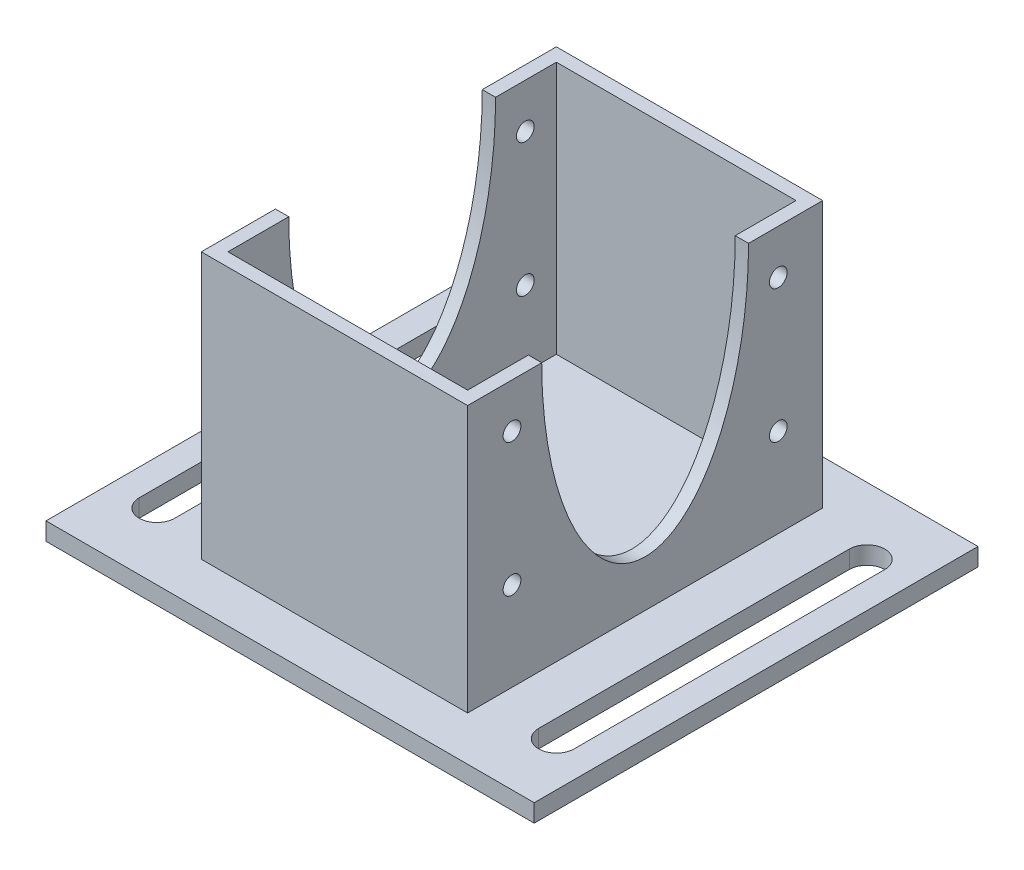
ISO-10303-21;
HEADER;
FILE_DESCRIPTION(('STEP AP214'),'2;1');
FILE_NAME('part.step','',(''),(''),'','','');
FILE_SCHEMA(('AUTOMOTIVE_DESIGN { 1 0 10303 214 1 1 1 1 }'));
ENDSEC;
DATA;
#1=APPLICATION_CONTEXT('core data for automotive mechanical design processes');
#2=APPLICATION_PROTOCOL_DEFINITION('international standard','automotive_design',2000,#1);
#3=PRODUCT_CONTEXT('',#1,'mechanical');
#4=PRODUCT('Part','Part','',(#3));
#5=PRODUCT_RELATED_PRODUCT_CATEGORY('part','',(#4));
#6=PRODUCT_DEFINITION_FORMATION('','',#4);
#7=PRODUCT_DEFINITION_CONTEXT('part definition',#1,'design');
#8=PRODUCT_DEFINITION('design','',#6,#7);
#9=PRODUCT_DEFINITION_SHAPE('','',#8);
#10=(LENGTH_UNIT() NAMED_UNIT(*) SI_UNIT(.MILLI.,.METRE.));
#11=(NAMED_UNIT(*) PLANE_ANGLE_UNIT() SI_UNIT($,.RADIAN.));
#12=(NAMED_UNIT(*) SI_UNIT($,.STERADIAN.) SOLID_ANGLE_UNIT());
#13=UNCERTAINTY_MEASURE_WITH_UNIT(LENGTH_MEASURE(1.E-05),#10,'distance_accuracy_value','');
#14=(GEOMETRIC_REPRESENTATION_CONTEXT(3) GLOBAL_UNCERTAINTY_ASSIGNED_CONTEXT((#13)) GLOBAL_UNIT_ASSIGNED_CONTEXT((#10,
#11,#12)) REPRESENTATION_CONTEXT('',''));
#15=CARTESIAN_POINT('',(0.,0.,0.));
#16=DIRECTION('',(0.,0.,1.));
#17=DIRECTION('',(1.,0.,0.));
#18=AXIS2_PLACEMENT_3D('',#15,#16,#17);
#19=CARTESIAN_POINT('',(0.,76.2,0.));
#20=DIRECTION('',(0.,-1.,0.));
#21=DIRECTION('',(0.,0.,-1.));
#22=AXIS2_PLACEMENT_3D('',#19,#20,#21);
#23=PLANE('',#22);
#24=DIRECTION('',(0.,0.,1.));
#25=VECTOR('',#24,1.);
#26=CARTESIAN_POINT('',(-34.29,76.2,0.));
#27=LINE('',#26,#25);
#28=CARTESIAN_POINT('',(-34.29,76.2,-46.99));
#29=VERTEX_POINT('',#28);
#30=CARTESIAN_POINT('',(-34.29,76.2,-29.5918380857821));
#31=VERTEX_POINT('',#30);
#32=EDGE_CURVE('E411',#29,#31,#27,.T.);
#33=ORIENTED_EDGE('',*,*,#32,.F.);
#34=DIRECTION('',(1.,0.,0.));
#35=VECTOR('',#34,1.);
#36=CARTESIAN_POINT('',(0.,76.2,-46.99));
#37=LINE('',#36,#35);
#38=CARTESIAN_POINT('',(34.29,76.2,-46.99));
#39=VERTEX_POINT('',#38);
#40=EDGE_CURVE('E415',#29,#39,#37,.T.);
#41=ORIENTED_EDGE('',*,*,#40,.T.);
#42=DIRECTION('',(0.,0.,1.));
#43=VECTOR('',#42,1.);
#44=CARTESIAN_POINT('',(34.29,76.2,0.));
#45=LINE('',#44,#43);
#46=CARTESIAN_POINT('',(34.29,76.2,-29.5918380857821));
#47=VERTEX_POINT('',#46);
#48=EDGE_CURVE('E442',#39,#47,#45,.T.);
#49=ORIENTED_EDGE('',*,*,#48,.T.);
#50=DIRECTION('',(-1.,0.,0.));
#51=VECTOR('',#50,1.);
#52=CARTESIAN_POINT('',(38.1,76.2,-29.5918380857821));
#53=LINE('',#52,#51);
#54=CARTESIAN_POINT('',(38.1,76.2,-29.5918380857821));
#55=VERTEX_POINT('',#54);
#56=EDGE_CURVE('E539',#47,#55,#53,.F.);
#57=ORIENTED_EDGE('',*,*,#56,.T.);
#58=DIRECTION('',(0.,0.,1.));
#59=VECTOR('',#58,1.);
#60=CARTESIAN_POINT('',(38.1,76.2,-50.8));
#61=LINE('',#60,#59);
#62=CARTESIAN_POINT('',(38.1,76.2,-50.8));
#63=VERTEX_POINT('',#62);
#64=EDGE_CURVE('E501',#63,#55,#61,.T.);
#65=ORIENTED_EDGE('',*,*,#64,.F.);
#66=DIRECTION('',(1.,0.,0.));
#67=VECTOR('',#66,1.);
#68=CARTESIAN_POINT('',(-38.1,76.2,-50.8));
#69=LINE('',#68,#67);
#70=CARTESIAN_POINT('',(-38.1,76.2,-50.8));
#71=VERTEX_POINT('',#70);
#72=EDGE_CURVE('E508',#71,#63,#69,.T.);
#73=ORIENTED_EDGE('',*,*,#72,.F.);
#74=DIRECTION('',(0.,0.,1.));
#75=VECTOR('',#74,1.);
#76=CARTESIAN_POINT('',(-38.1,76.2,-50.8));
#77=LINE('',#76,#75);
#78=CARTESIAN_POINT('',(-38.1,76.2,-29.5918380857821));
#79=VERTEX_POINT('',#78);
#80=EDGE_CURVE('E518',#71,#79,#77,.T.);
#81=ORIENTED_EDGE('',*,*,#80,.T.);
#82=EDGE_CURVE('E550',#79,#31,#53,.F.);
#83=ORIENTED_EDGE('',*,*,#82,.T.);
#84=EDGE_LOOP('',(#33,#41,#49,#57,#65,#73,#81,#83));
#85=FACE_BOUND('',#84,.T.);
#86=ADVANCED_FACE('F45',(#85),#23,.F.);
#87=CARTESIAN_POINT('',(38.1,76.2,0.));
#88=DIRECTION('',(-1.,0.,0.));
#89=DIRECTION('',(0.,-1.,0.));
#90=AXIS2_PLACEMENT_3D('',#87,#88,#89);
#91=ELLIPSE('',#90,62.8740047000173,29.591838085782);
#92=DIRECTION('',(-1.,0.,0.));
#93=VECTOR('',#92,1.);
#94=SURFACE_OF_LINEAR_EXTRUSION('',#91,#93);
#95=CARTESIAN_POINT('',(-34.29,76.2,0.));
#96=DIRECTION('',(-1.,0.,0.));
#97=DIRECTION('',(0.,-1.,0.));
#98=AXIS2_PLACEMENT_3D('',#95,#96,#97);
#99=ELLIPSE('',#98,62.8740047000173,29.591838085782);
#100=CARTESIAN_POINT('',(-34.29,76.2,29.591838085782));
#101=VERTEX_POINT('',#100);
#102=EDGE_CURVE('E395',#31,#101,#99,.T.);
#103=ORIENTED_EDGE('',*,*,#102,.F.);
#104=ORIENTED_EDGE('',*,*,#82,.F.);
#105=CARTESIAN_POINT('',(-38.1,76.2,0.));
#106=DIRECTION('',(-1.,0.,0.));
#107=DIRECTION('',(0.,-1.,0.));
#108=AXIS2_PLACEMENT_3D('',#105,#106,#107);
#109=ELLIPSE('',#108,62.8740047000173,29.591838085782);
#110=CARTESIAN_POINT('',(-38.1,76.2,29.591838085782));
#111=VERTEX_POINT('',#110);
#112=EDGE_CURVE('E405',#79,#111,#109,.T.);
#113=ORIENTED_EDGE('',*,*,#112,.T.);
#114=DIRECTION('',(-1.,0.,0.));
#115=VECTOR('',#114,1.);
#116=CARTESIAN_POINT('',(38.1,76.2,29.591838085782));
#117=LINE('',#116,#115);
#118=EDGE_CURVE('E55',#101,#111,#117,.T.);
#119=ORIENTED_EDGE('',*,*,#118,.F.);
#120=EDGE_LOOP('',(#103,#104,#113,#119));
#121=FACE_BOUND('',#120,.T.);
#122=ADVANCED_FACE('F467',(#121),#94,.F.);
#123=CARTESIAN_POINT('',(38.1,76.2,29.591838085782));
#124=VERTEX_POINT('',#123);
#125=CARTESIAN_POINT('',(34.29,76.2,29.591838085782));
#126=VERTEX_POINT('',#125);
#127=EDGE_CURVE('E11',#124,#126,#117,.T.);
#128=ORIENTED_EDGE('',*,*,#127,.T.);
#129=DIRECTION('',(0.,0.,1.));
#130=VECTOR('',#129,1.);
#131=CARTESIAN_POINT('',(34.29,76.2,0.));
#132=LINE('',#131,#130);
#133=CARTESIAN_POINT('',(34.29,76.2,46.99));
#134=VERTEX_POINT('',#133);
#135=EDGE_CURVE('E431',#126,#134,#132,.T.);
#136=ORIENTED_EDGE('',*,*,#135,.T.);
#137=DIRECTION('',(1.,0.,0.));
#138=VECTOR('',#137,1.);
#139=CARTESIAN_POINT('',(0.,76.2,46.99));
#140=LINE('',#139,#138);
#141=CARTESIAN_POINT('',(-34.29,76.2,46.99));
#142=VERTEX_POINT('',#141);
#143=EDGE_CURVE('E439',#142,#134,#140,.T.);
#144=ORIENTED_EDGE('',*,*,#143,.F.);
#145=DIRECTION('',(0.,0.,1.));
#146=VECTOR('',#145,1.);
#147=CARTESIAN_POINT('',(-34.29,76.2,0.));
#148=LINE('',#147,#146);
#149=EDGE_CURVE('E434',#101,#142,#148,.T.);
#150=ORIENTED_EDGE('',*,*,#149,.F.);
#151=ORIENTED_EDGE('',*,*,#118,.T.);
#152=CARTESIAN_POINT('',(-38.1,76.2,50.8));
#153=VERTEX_POINT('',#152);
#154=EDGE_CURVE('E517',#111,#153,#77,.T.);
#155=ORIENTED_EDGE('',*,*,#154,.T.);
#156=DIRECTION('',(1.,0.,0.));
#157=VECTOR('',#156,1.);
#158=CARTESIAN_POINT('',(-38.1,76.2,50.8));
#159=LINE('',#158,#157);
#160=CARTESIAN_POINT('',(38.1,76.2,50.8));
#161=VERTEX_POINT('',#160);
#162=EDGE_CURVE('E505',#153,#161,#159,.T.);
#163=ORIENTED_EDGE('',*,*,#162,.T.);
#164=EDGE_CURVE('E498',#124,#161,#61,.T.);
#165=ORIENTED_EDGE('',*,*,#164,.F.);
#166=EDGE_LOOP('',(#128,#136,#144,#150,#151,#155,#163,#165));
#167=FACE_BOUND('',#166,.T.);
#168=ADVANCED_FACE('F473',(#167),#23,.F.);
#169=CARTESIAN_POINT('',(-38.1,76.2,-50.8));
#170=DIRECTION('',(0.,0.,-1.));
#171=DIRECTION('',(-1.,0.,0.));
#172=AXIS2_PLACEMENT_3D('',#169,#170,#171);
#173=PLANE('',#172);
#174=DIRECTION('',(1.,0.,0.));
#175=VECTOR('',#174,1.);
#176=CARTESIAN_POINT('',(-38.1,0.,-50.8));
#177=LINE('',#176,#175);
#178=CARTESIAN_POINT('',(-38.1,0.,-50.8));
#179=VERTEX_POINT('',#178);
#180=CARTESIAN_POINT('',(38.1,0.,-50.8));
#181=VERTEX_POINT('',#180);
#182=EDGE_CURVE('E457',#179,#181,#177,.T.);
#183=ORIENTED_EDGE('',*,*,#182,.F.);
#184=DIRECTION('',(0.,-1.,0.));
#185=VECTOR('',#184,1.);
#186=CARTESIAN_POINT('',(-38.1,76.2,-50.8));
#187=LINE('',#186,#185);
#188=EDGE_CURVE('E535',#71,#179,#187,.T.);
#189=ORIENTED_EDGE('',*,*,#188,.F.);
#190=ORIENTED_EDGE('',*,*,#72,.T.);
#191=DIRECTION('',(0.,-1.,0.));
#192=VECTOR('',#191,1.);
#193=CARTESIAN_POINT('',(38.1,76.2,-50.8));
#194=LINE('',#193,#192);
#195=EDGE_CURVE('E522',#63,#181,#194,.T.);
#196=ORIENTED_EDGE('',*,*,#195,.T.);
#197=EDGE_LOOP('',(#183,#189,#190,#196));
#198=FACE_BOUND('',#197,.T.);
#199=ADVANCED_FACE('F47',(#198),#173,.T.);
#200=CARTESIAN_POINT('',(-38.1,76.2,-50.8));
#201=DIRECTION('',(1.,0.,0.));
#202=DIRECTION('',(0.,0.,-1.));
#203=AXIS2_PLACEMENT_3D('',#200,#201,#202);
#204=PLANE('',#203);
#205=CARTESIAN_POINT('',(-38.1,63.5,38.1));
#206=DIRECTION('',(-1.,0.,0.));
#207=DIRECTION('',(0.,0.,-1.));
#208=AXIS2_PLACEMENT_3D('',#205,#206,#207);
#209=CIRCLE('',#208,2.54);
#210=CARTESIAN_POINT('',(-38.1,63.5,35.56));
#211=VERTEX_POINT('',#210);
#212=EDGE_CURVE('E362',#211,#211,#209,.T.);
#213=ORIENTED_EDGE('',*,*,#212,.F.);
#214=EDGE_LOOP('',(#213));
#215=FACE_BOUND('',#214,.T.);
#216=CARTESIAN_POINT('',(-38.1,25.4,38.1));
#217=DIRECTION('',(-1.,0.,0.));
#218=DIRECTION('',(0.,0.,-1.));
#219=AXIS2_PLACEMENT_3D('',#216,#217,#218);
#220=CIRCLE('',#219,2.54);
#221=CARTESIAN_POINT('',(-38.1,25.4,35.56));
#222=VERTEX_POINT('',#221);
#223=EDGE_CURVE('E354',#222,#222,#220,.T.);
#224=ORIENTED_EDGE('',*,*,#223,.F.);
#225=EDGE_LOOP('',(#224));
#226=FACE_BOUND('',#225,.T.);
#227=CARTESIAN_POINT('',(-38.1,25.4,-38.1));
#228=DIRECTION('',(-1.,0.,0.));
#229=DIRECTION('',(0.,0.,1.));
#230=AXIS2_PLACEMENT_3D('',#227,#228,#229);
#231=CIRCLE('',#230,2.54);
#232=CARTESIAN_POINT('',(-38.1,25.4,-35.56));
#233=VERTEX_POINT('',#232);
#234=EDGE_CURVE('E345',#233,#233,#231,.T.);
#235=ORIENTED_EDGE('',*,*,#234,.F.);
#236=EDGE_LOOP('',(#235));
#237=FACE_BOUND('',#236,.T.);
#238=CARTESIAN_POINT('',(-38.1,63.5,-38.1));
#239=DIRECTION('',(-1.,0.,0.));
#240=DIRECTION('',(0.,0.,1.));
#241=AXIS2_PLACEMENT_3D('',#238,#239,#240);
#242=CIRCLE('',#241,2.54);
#243=CARTESIAN_POINT('',(-38.1,63.5,-35.56));
#244=VERTEX_POINT('',#243);
#245=EDGE_CURVE('E349',#244,#244,#242,.T.);
#246=ORIENTED_EDGE('',*,*,#245,.F.);
#247=EDGE_LOOP('',(#246));
#248=FACE_BOUND('',#247,.T.);
#249=ORIENTED_EDGE('',*,*,#154,.F.);
#250=ORIENTED_EDGE('',*,*,#112,.F.);
#251=ORIENTED_EDGE('',*,*,#80,.F.);
#252=ORIENTED_EDGE('',*,*,#188,.T.);
#253=DIRECTION('',(0.,0.,1.));
#254=VECTOR('',#253,1.);
#255=CARTESIAN_POINT('',(-38.1,0.,-50.8));
#256=LINE('',#255,#254);
#257=CARTESIAN_POINT('',(-38.1,0.,50.8));
#258=VERTEX_POINT('',#257);
#259=EDGE_CURVE('E513',#179,#258,#256,.T.);
#260=ORIENTED_EDGE('',*,*,#259,.T.);
#261=DIRECTION('',(0.,-1.,0.));
#262=VECTOR('',#261,1.);
#263=CARTESIAN_POINT('',(-38.1,76.2,50.8));
#264=LINE('',#263,#262);
#265=EDGE_CURVE('E540',#153,#258,#264,.T.);
#266=ORIENTED_EDGE('',*,*,#265,.F.);
#267=EDGE_LOOP('',(#249,#250,#251,#252,#260,#266));
#268=FACE_BOUND('',#267,.T.);
#269=ADVANCED_FACE('F474',(#215,#226,#237,#248,#268),#204,.F.);
#270=CARTESIAN_POINT('',(-38.1,76.2,50.8));
#271=DIRECTION('',(0.,0.,-1.));
#272=DIRECTION('',(-1.,0.,0.));
#273=AXIS2_PLACEMENT_3D('',#270,#271,#272);
#274=PLANE('',#273);
#275=DIRECTION('',(1.,0.,0.));
#276=VECTOR('',#275,1.);
#277=CARTESIAN_POINT('',(-38.1,0.,50.8));
#278=LINE('',#277,#276);
#279=CARTESIAN_POINT('',(38.1,0.,50.8));
#280=VERTEX_POINT('',#279);
#281=EDGE_CURVE('E528',#258,#280,#278,.T.);
#282=ORIENTED_EDGE('',*,*,#281,.T.);
#283=DIRECTION('',(0.,-1.,0.));
#284=VECTOR('',#283,1.);
#285=CARTESIAN_POINT('',(38.1,76.2,50.8));
#286=LINE('',#285,#284);
#287=EDGE_CURVE('E544',#161,#280,#286,.T.);
#288=ORIENTED_EDGE('',*,*,#287,.F.);
#289=ORIENTED_EDGE('',*,*,#162,.F.);
#290=ORIENTED_EDGE('',*,*,#265,.T.);
#291=EDGE_LOOP('',(#282,#288,#289,#290));
#292=FACE_BOUND('',#291,.T.);
#293=ADVANCED_FACE('F477',(#292),#274,.F.);
#294=CARTESIAN_POINT('',(38.1,76.2,-50.8));
#295=DIRECTION('',(1.,0.,0.));
#296=DIRECTION('',(0.,0.,-1.));
#297=AXIS2_PLACEMENT_3D('',#294,#295,#296);
#298=PLANE('',#297);
#299=CARTESIAN_POINT('',(38.1,63.5,38.1));
#300=DIRECTION('',(-1.,0.,0.));
#301=DIRECTION('',(0.,0.,-1.));
#302=AXIS2_PLACEMENT_3D('',#299,#300,#301);
#303=CIRCLE('',#302,2.54);
#304=CARTESIAN_POINT('',(38.1,63.5,35.56));
#305=VERTEX_POINT('',#304);
#306=EDGE_CURVE('E344',#305,#305,#303,.T.);
#307=ORIENTED_EDGE('',*,*,#306,.T.);
#308=EDGE_LOOP('',(#307));
#309=FACE_BOUND('',#308,.T.);
#310=CARTESIAN_POINT('',(38.1,25.4,38.1));
#311=DIRECTION('',(-1.,0.,0.));
#312=DIRECTION('',(0.,0.,-1.));
#313=AXIS2_PLACEMENT_3D('',#310,#311,#312);
#314=CIRCLE('',#313,2.54);
#315=CARTESIAN_POINT('',(38.1,25.4,35.56));
#316=VERTEX_POINT('',#315);
#317=EDGE_CURVE('E358',#316,#316,#314,.T.);
#318=ORIENTED_EDGE('',*,*,#317,.T.);
#319=EDGE_LOOP('',(#318));
#320=FACE_BOUND('',#319,.T.);
#321=CARTESIAN_POINT('',(38.1,25.4,-38.1));
#322=DIRECTION('',(-1.,0.,0.));
#323=DIRECTION('',(0.,0.,1.));
#324=AXIS2_PLACEMENT_3D('',#321,#322,#323);
#325=CIRCLE('',#324,2.54);
#326=CARTESIAN_POINT('',(38.1,25.4,-35.56));
#327=VERTEX_POINT('',#326);
#328=EDGE_CURVE('E350',#327,#327,#325,.T.);
#329=ORIENTED_EDGE('',*,*,#328,.T.);
#330=EDGE_LOOP('',(#329));
#331=FACE_BOUND('',#330,.T.);
#332=CARTESIAN_POINT('',(38.1,63.5,-38.1));
#333=DIRECTION('',(-1.,0.,0.));
#334=DIRECTION('',(0.,0.,1.));
#335=AXIS2_PLACEMENT_3D('',#332,#333,#334);
#336=CIRCLE('',#335,2.54);
#337=CARTESIAN_POINT('',(38.1,63.5,-35.56));
#338=VERTEX_POINT('',#337);
#339=EDGE_CURVE('E369',#338,#338,#336,.T.);
#340=ORIENTED_EDGE('',*,*,#339,.T.);
#341=EDGE_LOOP('',(#340));
#342=FACE_BOUND('',#341,.T.);
#343=EDGE_CURVE('E452',#55,#124,#91,.T.);
#344=ORIENTED_EDGE('',*,*,#343,.T.);
#345=ORIENTED_EDGE('',*,*,#164,.T.);
#346=ORIENTED_EDGE('',*,*,#287,.T.);
#347=DIRECTION('',(0.,0.,1.));
#348=VECTOR('',#347,1.);
#349=CARTESIAN_POINT('',(38.1,0.,-50.8));
#350=LINE('',#349,#348);
#351=EDGE_CURVE('E525',#181,#280,#350,.T.);
#352=ORIENTED_EDGE('',*,*,#351,.F.);
#353=ORIENTED_EDGE('',*,*,#195,.F.);
#354=ORIENTED_EDGE('',*,*,#64,.T.);
#355=EDGE_LOOP('',(#344,#345,#346,#352,#353,#354));
#356=FACE_BOUND('',#355,.T.);
#357=ADVANCED_FACE('F465',(#309,#320,#331,#342,#356),#298,.T.);
#358=ORIENTED_EDGE('',*,*,#56,.F.);
#359=CARTESIAN_POINT('',(34.29,76.2,0.));
#360=DIRECTION('',(-1.,0.,0.));
#361=DIRECTION('',(0.,-1.,0.));
#362=AXIS2_PLACEMENT_3D('',#359,#360,#361);
#363=ELLIPSE('',#362,62.8740047000173,29.591838085782);
#364=EDGE_CURVE('E401',#47,#126,#363,.T.);
#365=ORIENTED_EDGE('',*,*,#364,.T.);
#366=ORIENTED_EDGE('',*,*,#127,.F.);
#367=ORIENTED_EDGE('',*,*,#343,.F.);
#368=EDGE_LOOP('',(#358,#365,#366,#367));
#369=FACE_BOUND('',#368,.T.);
#370=ADVANCED_FACE('F460',(#369),#94,.F.);
#371=CARTESIAN_POINT('',(-38.1,76.2,-46.99));
#372=DIRECTION('',(0.,0.,-1.));
#373=DIRECTION('',(-1.,0.,0.));
#374=AXIS2_PLACEMENT_3D('',#371,#372,#373);
#375=PLANE('',#374);
#376=DIRECTION('',(1.,0.,0.));
#377=VECTOR('',#376,1.);
#378=CARTESIAN_POINT('',(0.,3.81,-46.99));
#379=LINE('',#378,#377);
#380=CARTESIAN_POINT('',(-34.29,3.81,-46.99));
#381=VERTEX_POINT('',#380);
#382=CARTESIAN_POINT('',(34.29,3.81,-46.99));
#383=VERTEX_POINT('',#382);
#384=EDGE_CURVE('E396',#381,#383,#379,.T.);
#385=ORIENTED_EDGE('',*,*,#384,.T.);
#386=DIRECTION('',(0.,-1.,0.));
#387=VECTOR('',#386,1.);
#388=CARTESIAN_POINT('',(34.29,76.2,-46.99));
#389=LINE('',#388,#387);
#390=EDGE_CURVE('E407',#39,#383,#389,.T.);
#391=ORIENTED_EDGE('',*,*,#390,.F.);
#392=ORIENTED_EDGE('',*,*,#40,.F.);
#393=DIRECTION('',(0.,-1.,0.));
#394=VECTOR('',#393,1.);
#395=CARTESIAN_POINT('',(-34.29,76.2,-46.99));
#396=LINE('',#395,#394);
#397=EDGE_CURVE('E402',#29,#381,#396,.T.);
#398=ORIENTED_EDGE('',*,*,#397,.T.);
#399=EDGE_LOOP('',(#385,#391,#392,#398));
#400=FACE_BOUND('',#399,.T.);
#401=ADVANCED_FACE('F464',(#400),#375,.F.);
#402=CARTESIAN_POINT('',(-34.29,76.2,-50.8));
#403=DIRECTION('',(1.,0.,0.));
#404=DIRECTION('',(0.,0.,-1.));
#405=AXIS2_PLACEMENT_3D('',#402,#403,#404);
#406=PLANE('',#405);
#407=CARTESIAN_POINT('',(-34.29,63.5,38.1));
#408=DIRECTION('',(1.,0.,0.));
#409=DIRECTION('',(0.,0.,-1.));
#410=AXIS2_PLACEMENT_3D('',#407,#408,#409);
#411=CIRCLE('',#410,2.54);
#412=CARTESIAN_POINT('',(-34.29,63.5,35.56));
#413=VERTEX_POINT('',#412);
#414=EDGE_CURVE('E391',#413,#413,#411,.T.);
#415=ORIENTED_EDGE('',*,*,#414,.F.);
#416=EDGE_LOOP('',(#415));
#417=FACE_BOUND('',#416,.T.);
#418=CARTESIAN_POINT('',(-34.29,25.4,38.1));
#419=DIRECTION('',(1.,0.,0.));
#420=DIRECTION('',(0.,0.,-1.));
#421=AXIS2_PLACEMENT_3D('',#418,#419,#420);
#422=CIRCLE('',#421,2.54);
#423=CARTESIAN_POINT('',(-34.29,25.4,35.56));
#424=VERTEX_POINT('',#423);
#425=EDGE_CURVE('E387',#424,#424,#422,.T.);
#426=ORIENTED_EDGE('',*,*,#425,.F.);
#427=EDGE_LOOP('',(#426));
#428=FACE_BOUND('',#427,.T.);
#429=CARTESIAN_POINT('',(-34.29,25.4,-38.1));
#430=DIRECTION('',(1.,0.,0.));
#431=DIRECTION('',(0.,0.,-1.));
#432=AXIS2_PLACEMENT_3D('',#429,#430,#431);
#433=CIRCLE('',#432,2.54);
#434=CARTESIAN_POINT('',(-34.29,25.4,-40.64));
#435=VERTEX_POINT('',#434);
#436=EDGE_CURVE('E382',#435,#435,#433,.T.);
#437=ORIENTED_EDGE('',*,*,#436,.F.);
#438=EDGE_LOOP('',(#437));
#439=FACE_BOUND('',#438,.T.);
#440=CARTESIAN_POINT('',(-34.29,63.5,-38.1));
#441=DIRECTION('',(1.,0.,0.));
#442=DIRECTION('',(0.,0.,-1.));
#443=AXIS2_PLACEMENT_3D('',#440,#441,#442);
#444=CIRCLE('',#443,2.54);
#445=CARTESIAN_POINT('',(-34.29,63.5,-40.64));
#446=VERTEX_POINT('',#445);
#447=EDGE_CURVE('E377',#446,#446,#444,.T.);
#448=ORIENTED_EDGE('',*,*,#447,.F.);
#449=EDGE_LOOP('',(#448));
#450=FACE_BOUND('',#449,.T.);
#451=ORIENTED_EDGE('',*,*,#149,.T.);
#452=DIRECTION('',(0.,-1.,0.));
#453=VECTOR('',#452,1.);
#454=CARTESIAN_POINT('',(-34.29,76.2,46.99));
#455=LINE('',#454,#453);
#456=CARTESIAN_POINT('',(-34.29,3.81,46.99));
#457=VERTEX_POINT('',#456);
#458=EDGE_CURVE('E406',#142,#457,#455,.T.);
#459=ORIENTED_EDGE('',*,*,#458,.T.);
#460=DIRECTION('',(0.,0.,1.));
#461=VECTOR('',#460,1.);
#462=CARTESIAN_POINT('',(-34.29,3.81,0.));
#463=LINE('',#462,#461);
#464=EDGE_CURVE('E412',#381,#457,#463,.T.);
#465=ORIENTED_EDGE('',*,*,#464,.F.);
#466=ORIENTED_EDGE('',*,*,#397,.F.);
#467=ORIENTED_EDGE('',*,*,#32,.T.);
#468=ORIENTED_EDGE('',*,*,#102,.T.);
#469=EDGE_LOOP('',(#451,#459,#465,#466,#467,#468));
#470=FACE_BOUND('',#469,.T.);
#471=ADVANCED_FACE('F631',(#417,#428,#439,#450,#470),#406,.T.);
#472=CARTESIAN_POINT('',(-38.1,76.2,46.99));
#473=DIRECTION('',(0.,0.,-1.));
#474=DIRECTION('',(-1.,0.,0.));
#475=AXIS2_PLACEMENT_3D('',#472,#473,#474);
#476=PLANE('',#475);
#477=DIRECTION('',(1.,0.,0.));
#478=VECTOR('',#477,1.);
#479=CARTESIAN_POINT('',(0.,3.81,46.99));
#480=LINE('',#479,#478);
#481=CARTESIAN_POINT('',(34.29,3.81,46.99));
#482=VERTEX_POINT('',#481);
#483=EDGE_CURVE('E416',#457,#482,#480,.T.);
#484=ORIENTED_EDGE('',*,*,#483,.F.);
#485=ORIENTED_EDGE('',*,*,#458,.F.);
#486=ORIENTED_EDGE('',*,*,#143,.T.);
#487=DIRECTION('',(0.,-1.,0.));
#488=VECTOR('',#487,1.);
#489=CARTESIAN_POINT('',(34.29,76.2,46.99));
#490=LINE('',#489,#488);
#491=EDGE_CURVE('E410',#134,#482,#490,.T.);
#492=ORIENTED_EDGE('',*,*,#491,.T.);
#493=EDGE_LOOP('',(#484,#485,#486,#492));
#494=FACE_BOUND('',#493,.T.);
#495=ADVANCED_FACE('F623',(#494),#476,.T.);
#496=CARTESIAN_POINT('',(34.29,76.2,-50.8));
#497=DIRECTION('',(1.,0.,0.));
#498=DIRECTION('',(0.,0.,-1.));
#499=AXIS2_PLACEMENT_3D('',#496,#497,#498);
#500=PLANE('',#499);
#501=CARTESIAN_POINT('',(34.29,63.5,38.1));
#502=DIRECTION('',(1.,0.,0.));
#503=DIRECTION('',(0.,0.,-1.));
#504=AXIS2_PLACEMENT_3D('',#501,#502,#503);
#505=CIRCLE('',#504,2.54);
#506=CARTESIAN_POINT('',(34.29,63.5,35.56));
#507=VERTEX_POINT('',#506);
#508=EDGE_CURVE('E49',#507,#507,#505,.T.);
#509=ORIENTED_EDGE('',*,*,#508,.T.);
#510=EDGE_LOOP('',(#509));
#511=FACE_BOUND('',#510,.T.);
#512=CARTESIAN_POINT('',(34.29,25.4,38.1));
#513=DIRECTION('',(1.,0.,0.));
#514=DIRECTION('',(0.,0.,-1.));
#515=AXIS2_PLACEMENT_3D('',#512,#513,#514);
#516=CIRCLE('',#515,2.54);
#517=CARTESIAN_POINT('',(34.29,25.4,35.56));
#518=VERTEX_POINT('',#517);
#519=EDGE_CURVE('E386',#518,#518,#516,.T.);
#520=ORIENTED_EDGE('',*,*,#519,.T.);
#521=EDGE_LOOP('',(#520));
#522=FACE_BOUND('',#521,.T.);
#523=CARTESIAN_POINT('',(34.29,25.4,-38.1));
#524=DIRECTION('',(1.,0.,0.));
#525=DIRECTION('',(0.,0.,-1.));
#526=AXIS2_PLACEMENT_3D('',#523,#524,#525);
#527=CIRCLE('',#526,2.54);
#528=CARTESIAN_POINT('',(34.29,25.4,-40.64));
#529=VERTEX_POINT('',#528);
#530=EDGE_CURVE('E381',#529,#529,#527,.T.);
#531=ORIENTED_EDGE('',*,*,#530,.T.);
#532=EDGE_LOOP('',(#531));
#533=FACE_BOUND('',#532,.T.);
#534=CARTESIAN_POINT('',(34.29,63.5,-38.1));
#535=DIRECTION('',(1.,0.,0.));
#536=DIRECTION('',(0.,0.,-1.));
#537=AXIS2_PLACEMENT_3D('',#534,#535,#536);
#538=CIRCLE('',#537,2.54);
#539=CARTESIAN_POINT('',(34.29,63.5,-40.64));
#540=VERTEX_POINT('',#539);
#541=EDGE_CURVE('E373',#540,#540,#538,.T.);
#542=ORIENTED_EDGE('',*,*,#541,.T.);
#543=EDGE_LOOP('',(#542));
#544=FACE_BOUND('',#543,.T.);
#545=ORIENTED_EDGE('',*,*,#364,.F.);
#546=ORIENTED_EDGE('',*,*,#48,.F.);
#547=ORIENTED_EDGE('',*,*,#390,.T.);
#548=DIRECTION('',(0.,0.,1.));
#549=VECTOR('',#548,1.);
#550=CARTESIAN_POINT('',(34.29,3.81,0.));
#551=LINE('',#550,#549);
#552=EDGE_CURVE('E400',#383,#482,#551,.T.);
#553=ORIENTED_EDGE('',*,*,#552,.T.);
#554=ORIENTED_EDGE('',*,*,#491,.F.);
#555=ORIENTED_EDGE('',*,*,#135,.F.);
#556=EDGE_LOOP('',(#545,#546,#547,#553,#554,#555));
#557=FACE_BOUND('',#556,.T.);
#558=ADVANCED_FACE('F563',(#511,#522,#533,#544,#557),#500,.F.);
#559=CARTESIAN_POINT('',(0.,3.81,0.));
#560=DIRECTION('',(0.,-1.,0.));
#561=DIRECTION('',(0.,0.,-1.));
#562=AXIS2_PLACEMENT_3D('',#559,#560,#561);
#563=PLANE('',#562);
#564=ORIENTED_EDGE('',*,*,#384,.F.);
#565=ORIENTED_EDGE('',*,*,#464,.T.);
#566=ORIENTED_EDGE('',*,*,#483,.T.);
#567=ORIENTED_EDGE('',*,*,#552,.F.);
#568=EDGE_LOOP('',(#564,#565,#566,#567));
#569=FACE_BOUND('',#568,.T.);
#570=ADVANCED_FACE('F468',(#569),#563,.F.);
#571=CARTESIAN_POINT('',(38.1,63.5,-38.1));
#572=DIRECTION('',(-1.,0.,0.));
#573=DIRECTION('',(0.,0.,1.));
#574=AXIS2_PLACEMENT_3D('',#571,#572,#573);
#575=CYLINDRICAL_SURFACE('',#574,2.54);
#576=ORIENTED_EDGE('',*,*,#339,.F.);
#577=EDGE_LOOP('',(#576));
#578=FACE_BOUND('',#577,.T.);
#579=ORIENTED_EDGE('',*,*,#541,.F.);
#580=EDGE_LOOP('',(#579));
#581=FACE_BOUND('',#580,.T.);
#582=ADVANCED_FACE('F581',(#578,#581),#575,.F.);
#583=CARTESIAN_POINT('',(38.1,25.4,-38.1));
#584=DIRECTION('',(-1.,0.,0.));
#585=DIRECTION('',(0.,0.,1.));
#586=AXIS2_PLACEMENT_3D('',#583,#584,#585);
#587=CYLINDRICAL_SURFACE('',#586,2.54);
#588=ORIENTED_EDGE('',*,*,#328,.F.);
#589=EDGE_LOOP('',(#588));
#590=FACE_BOUND('',#589,.T.);
#591=ORIENTED_EDGE('',*,*,#530,.F.);
#592=EDGE_LOOP('',(#591));
#593=FACE_BOUND('',#592,.T.);
#594=ADVANCED_FACE('F569',(#590,#593),#587,.F.);
#595=CARTESIAN_POINT('',(38.1,25.4,38.1));
#596=DIRECTION('',(-1.,0.,0.));
#597=DIRECTION('',(0.,0.,1.));
#598=AXIS2_PLACEMENT_3D('',#595,#596,#597);
#599=CYLINDRICAL_SURFACE('',#598,2.54);
#600=ORIENTED_EDGE('',*,*,#317,.F.);
#601=EDGE_LOOP('',(#600));
#602=FACE_BOUND('',#601,.T.);
#603=ORIENTED_EDGE('',*,*,#519,.F.);
#604=EDGE_LOOP('',(#603));
#605=FACE_BOUND('',#604,.T.);
#606=ADVANCED_FACE('F566',(#602,#605),#599,.F.);
#607=CARTESIAN_POINT('',(38.1,63.5,38.1));
#608=DIRECTION('',(-1.,0.,0.));
#609=DIRECTION('',(0.,0.,1.));
#610=AXIS2_PLACEMENT_3D('',#607,#608,#609);
#611=CYLINDRICAL_SURFACE('',#610,2.54);
#612=ORIENTED_EDGE('',*,*,#306,.F.);
#613=EDGE_LOOP('',(#612));
#614=FACE_BOUND('',#613,.T.);
#615=ORIENTED_EDGE('',*,*,#508,.F.);
#616=EDGE_LOOP('',(#615));
#617=FACE_BOUND('',#616,.T.);
#618=ADVANCED_FACE('F568',(#614,#617),#611,.F.);
#619=ORIENTED_EDGE('',*,*,#447,.T.);
#620=EDGE_LOOP('',(#619));
#621=FACE_BOUND('',#620,.T.);
#622=ORIENTED_EDGE('',*,*,#245,.T.);
#623=EDGE_LOOP('',(#622));
#624=FACE_BOUND('',#623,.T.);
#625=ADVANCED_FACE('F577',(#621,#624),#575,.F.);
#626=ORIENTED_EDGE('',*,*,#436,.T.);
#627=EDGE_LOOP('',(#626));
#628=FACE_BOUND('',#627,.T.);
#629=ORIENTED_EDGE('',*,*,#234,.T.);
#630=EDGE_LOOP('',(#629));
#631=FACE_BOUND('',#630,.T.);
#632=ADVANCED_FACE('F584',(#628,#631),#587,.F.);
#633=ORIENTED_EDGE('',*,*,#425,.T.);
#634=EDGE_LOOP('',(#633));
#635=FACE_BOUND('',#634,.T.);
#636=ORIENTED_EDGE('',*,*,#223,.T.);
#637=EDGE_LOOP('',(#636));
#638=FACE_BOUND('',#637,.T.);
#639=ADVANCED_FACE('F572',(#635,#638),#599,.F.);
#640=ORIENTED_EDGE('',*,*,#414,.T.);
#641=EDGE_LOOP('',(#640));
#642=FACE_BOUND('',#641,.T.);
#643=ORIENTED_EDGE('',*,*,#212,.T.);
#644=EDGE_LOOP('',(#643));
#645=FACE_BOUND('',#644,.T.);
#646=ADVANCED_FACE('F580',(#642,#645),#611,.F.);
#647=CARTESIAN_POINT('',(0.,0.,0.));
#648=DIRECTION('',(0.,-1.,0.));
#649=DIRECTION('',(0.,0.,-1.));
#650=AXIS2_PLACEMENT_3D('',#647,#648,#649);
#651=PLANE('',#650);
#652=DIRECTION('',(0.,0.,1.));
#653=VECTOR('',#652,1.);
#654=CARTESIAN_POINT('',(-62.23,0.,-44.45));
#655=LINE('',#654,#653);
#656=CARTESIAN_POINT('',(-62.23,0.,-44.45));
#657=VERTEX_POINT('',#656);
#658=CARTESIAN_POINT('',(-62.23,0.,44.45));
#659=VERTEX_POINT('',#658);
#660=EDGE_CURVE('E246',#657,#659,#655,.T.);
#661=ORIENTED_EDGE('',*,*,#660,.F.);
#662=CARTESIAN_POINT('',(-57.15,0.,-44.45));
#663=DIRECTION('',(0.,1.,0.));
#664=DIRECTION('',(0.,0.,1.));
#665=AXIS2_PLACEMENT_3D('',#662,#663,#664);
#666=CIRCLE('',#665,5.08);
#667=CARTESIAN_POINT('',(-52.07,0.,-44.45));
#668=VERTEX_POINT('',#667);
#669=EDGE_CURVE('E63',#668,#657,#666,.T.);
#670=ORIENTED_EDGE('',*,*,#669,.F.);
#671=DIRECTION('',(0.,0.,-1.));
#672=VECTOR('',#671,1.);
#673=CARTESIAN_POINT('',(-52.07,0.,-44.45));
#674=LINE('',#673,#672);
#675=CARTESIAN_POINT('',(-52.07,0.,44.45));
#676=VERTEX_POINT('',#675);
#677=EDGE_CURVE('E233',#676,#668,#674,.T.);
#678=ORIENTED_EDGE('',*,*,#677,.F.);
#679=CARTESIAN_POINT('',(-57.15,0.,44.45));
#680=DIRECTION('',(0.,1.,0.));
#681=DIRECTION('',(0.,0.,1.));
#682=AXIS2_PLACEMENT_3D('',#679,#680,#681);
#683=CIRCLE('',#682,5.08);
#684=EDGE_CURVE('E237',#659,#676,#683,.T.);
#685=ORIENTED_EDGE('',*,*,#684,.F.);
#686=EDGE_LOOP('',(#661,#670,#678,#685));
#687=FACE_BOUND('',#686,.T.);
#688=DIRECTION('',(0.,0.,1.));
#689=VECTOR('',#688,1.);
#690=CARTESIAN_POINT('',(52.07,0.,-44.45));
#691=LINE('',#690,#689);
#692=CARTESIAN_POINT('',(52.07,0.,-44.45));
#693=VERTEX_POINT('',#692);
#694=CARTESIAN_POINT('',(52.07,0.,44.45));
#695=VERTEX_POINT('',#694);
#696=EDGE_CURVE('E283',#693,#695,#691,.T.);
#697=ORIENTED_EDGE('',*,*,#696,.F.);
#698=CARTESIAN_POINT('',(57.15,0.,-44.45));
#699=DIRECTION('',(0.,1.,0.));
#700=DIRECTION('',(0.,0.,-1.));
#701=AXIS2_PLACEMENT_3D('',#698,#699,#700);
#702=CIRCLE('',#701,5.08000000000002);
#703=CARTESIAN_POINT('',(62.23,0.,-44.45));
#704=VERTEX_POINT('',#703);
#705=EDGE_CURVE('E71',#704,#693,#702,.T.);
#706=ORIENTED_EDGE('',*,*,#705,.F.);
#707=DIRECTION('',(0.,0.,-1.));
#708=VECTOR('',#707,1.);
#709=CARTESIAN_POINT('',(62.23,0.,-44.45));
#710=LINE('',#709,#708);
#711=CARTESIAN_POINT('',(62.23,0.,44.45));
#712=VERTEX_POINT('',#711);
#713=EDGE_CURVE('E274',#712,#704,#710,.T.);
#714=ORIENTED_EDGE('',*,*,#713,.F.);
#715=CARTESIAN_POINT('',(57.15,0.,44.45));
#716=DIRECTION('',(0.,1.,0.));
#717=DIRECTION('',(0.,0.,-1.));
#718=AXIS2_PLACEMENT_3D('',#715,#716,#717);
#719=CIRCLE('',#718,5.08000000000002);
#720=EDGE_CURVE('E278',#695,#712,#719,.T.);
#721=ORIENTED_EDGE('',*,*,#720,.F.);
#722=EDGE_LOOP('',(#697,#706,#714,#721));
#723=FACE_BOUND('',#722,.T.);
#724=DIRECTION('',(0.,0.,1.));
#725=VECTOR('',#724,1.);
#726=CARTESIAN_POINT('',(69.85,0.,63.5));
#727=LINE('',#726,#725);
#728=CARTESIAN_POINT('',(69.85,0.,-63.5));
#729=VERTEX_POINT('',#728);
#730=CARTESIAN_POINT('',(69.85,0.,63.5));
#731=VERTEX_POINT('',#730);
#732=EDGE_CURVE('E255',#729,#731,#727,.T.);
#733=ORIENTED_EDGE('',*,*,#732,.F.);
#734=DIRECTION('',(1.,0.,0.));
#735=VECTOR('',#734,1.);
#736=CARTESIAN_POINT('',(-69.85,0.,-63.5));
#737=LINE('',#736,#735);
#738=CARTESIAN_POINT('',(-69.85,0.,-63.5));
#739=VERTEX_POINT('',#738);
#740=EDGE_CURVE('E308',#739,#729,#737,.T.);
#741=ORIENTED_EDGE('',*,*,#740,.F.);
#742=DIRECTION('',(0.,0.,-1.));
#743=VECTOR('',#742,1.);
#744=CARTESIAN_POINT('',(-69.85,0.,63.5));
#745=LINE('',#744,#743);
#746=CARTESIAN_POINT('',(-69.85,0.,63.5));
#747=VERTEX_POINT('',#746);
#748=EDGE_CURVE('E324',#747,#739,#745,.T.);
#749=ORIENTED_EDGE('',*,*,#748,.F.);
#750=DIRECTION('',(-1.,0.,0.));
#751=VECTOR('',#750,1.);
#752=CARTESIAN_POINT('',(-69.85,0.,63.5));
#753=LINE('',#752,#751);
#754=EDGE_CURVE('E321',#731,#747,#753,.T.);
#755=ORIENTED_EDGE('',*,*,#754,.F.);
#756=EDGE_LOOP('',(#733,#741,#749,#755));
#757=FACE_BOUND('',#756,.T.);
#758=ORIENTED_EDGE('',*,*,#259,.F.);
#759=ORIENTED_EDGE('',*,*,#182,.T.);
#760=ORIENTED_EDGE('',*,*,#351,.T.);
#761=ORIENTED_EDGE('',*,*,#281,.F.);
#762=EDGE_LOOP('',(#758,#759,#760,#761));
#763=FACE_BOUND('',#762,.T.);
#764=ADVANCED_FACE('F591',(#687,#723,#757,#763),#651,.F.);
#765=CARTESIAN_POINT('',(69.85,-5.08,63.5));
#766=DIRECTION('',(-1.,0.,0.));
#767=DIRECTION('',(0.,0.,1.));
#768=AXIS2_PLACEMENT_3D('',#765,#766,#767);
#769=PLANE('',#768);
#770=ORIENTED_EDGE('',*,*,#732,.T.);
#771=DIRECTION('',(0.,1.,0.));
#772=VECTOR('',#771,1.);
#773=CARTESIAN_POINT('',(69.85,-5.08,63.5));
#774=LINE('',#773,#772);
#775=CARTESIAN_POINT('',(69.85,-5.08,63.5));
#776=VERTEX_POINT('',#775);
#777=EDGE_CURVE('E340',#776,#731,#774,.T.);
#778=ORIENTED_EDGE('',*,*,#777,.F.);
#779=DIRECTION('',(0.,0.,1.));
#780=VECTOR('',#779,1.);
#781=CARTESIAN_POINT('',(69.85,-5.08,63.5));
#782=LINE('',#781,#780);
#783=CARTESIAN_POINT('',(69.85,-5.08,-63.5));
#784=VERTEX_POINT('',#783);
#785=EDGE_CURVE('E303',#784,#776,#782,.T.);
#786=ORIENTED_EDGE('',*,*,#785,.F.);
#787=DIRECTION('',(0.,1.,0.));
#788=VECTOR('',#787,1.);
#789=CARTESIAN_POINT('',(69.85,-5.08,-63.5));
#790=LINE('',#789,#788);
#791=EDGE_CURVE('E317',#784,#729,#790,.T.);
#792=ORIENTED_EDGE('',*,*,#791,.T.);
#793=EDGE_LOOP('',(#770,#778,#786,#792));
#794=FACE_BOUND('',#793,.T.);
#795=ADVANCED_FACE('F668',(#794),#769,.F.);
#796=CARTESIAN_POINT('',(-69.85,-5.08,63.5));
#797=DIRECTION('',(0.,0.,-1.));
#798=DIRECTION('',(-1.,0.,0.));
#799=AXIS2_PLACEMENT_3D('',#796,#797,#798);
#800=PLANE('',#799);
#801=ORIENTED_EDGE('',*,*,#754,.T.);
#802=DIRECTION('',(0.,1.,0.));
#803=VECTOR('',#802,1.);
#804=CARTESIAN_POINT('',(-69.85,-5.08,63.5));
#805=LINE('',#804,#803);
#806=CARTESIAN_POINT('',(-69.85,-5.08,63.5));
#807=VERTEX_POINT('',#806);
#808=EDGE_CURVE('E336',#807,#747,#805,.T.);
#809=ORIENTED_EDGE('',*,*,#808,.F.);
#810=DIRECTION('',(-1.,0.,0.));
#811=VECTOR('',#810,1.);
#812=CARTESIAN_POINT('',(-69.85,-5.08,63.5));
#813=LINE('',#812,#811);
#814=EDGE_CURVE('E307',#776,#807,#813,.T.);
#815=ORIENTED_EDGE('',*,*,#814,.F.);
#816=ORIENTED_EDGE('',*,*,#777,.T.);
#817=EDGE_LOOP('',(#801,#809,#815,#816));
#818=FACE_BOUND('',#817,.T.);
#819=ADVANCED_FACE('F675',(#818),#800,.F.);
#820=CARTESIAN_POINT('',(-69.85,-5.08,63.5));
#821=DIRECTION('',(1.,0.,0.));
#822=DIRECTION('',(0.,0.,-1.));
#823=AXIS2_PLACEMENT_3D('',#820,#821,#822);
#824=PLANE('',#823);
#825=ORIENTED_EDGE('',*,*,#748,.T.);
#826=DIRECTION('',(0.,1.,0.));
#827=VECTOR('',#826,1.);
#828=CARTESIAN_POINT('',(-69.85,-5.08,-63.5));
#829=LINE('',#828,#827);
#830=CARTESIAN_POINT('',(-69.85,-5.08,-63.5));
#831=VERTEX_POINT('',#830);
#832=EDGE_CURVE('E332',#831,#739,#829,.T.);
#833=ORIENTED_EDGE('',*,*,#832,.F.);
#834=DIRECTION('',(0.,0.,-1.));
#835=VECTOR('',#834,1.);
#836=CARTESIAN_POINT('',(-69.85,-5.08,63.5));
#837=LINE('',#836,#835);
#838=EDGE_CURVE('E311',#807,#831,#837,.T.);
#839=ORIENTED_EDGE('',*,*,#838,.F.);
#840=ORIENTED_EDGE('',*,*,#808,.T.);
#841=EDGE_LOOP('',(#825,#833,#839,#840));
#842=FACE_BOUND('',#841,.T.);
#843=ADVANCED_FACE('F684',(#842),#824,.F.);
#844=CARTESIAN_POINT('',(-69.85,-5.08,-63.5));
#845=DIRECTION('',(0.,0.,1.));
#846=DIRECTION('',(1.,0.,0.));
#847=AXIS2_PLACEMENT_3D('',#844,#845,#846);
#848=PLANE('',#847);
#849=ORIENTED_EDGE('',*,*,#740,.T.);
#850=ORIENTED_EDGE('',*,*,#791,.F.);
#851=DIRECTION('',(1.,0.,0.));
#852=VECTOR('',#851,1.);
#853=CARTESIAN_POINT('',(-69.85,-5.08,-63.5));
#854=LINE('',#853,#852);
#855=EDGE_CURVE('E314',#831,#784,#854,.T.);
#856=ORIENTED_EDGE('',*,*,#855,.F.);
#857=ORIENTED_EDGE('',*,*,#832,.T.);
#858=EDGE_LOOP('',(#849,#850,#856,#857));
#859=FACE_BOUND('',#858,.T.);
#860=ADVANCED_FACE('F682',(#859),#848,.F.);
#861=CARTESIAN_POINT('',(0.,-5.08,0.));
#862=DIRECTION('',(0.,-1.,0.));
#863=DIRECTION('',(0.,0.,-1.));
#864=AXIS2_PLACEMENT_3D('',#861,#862,#863);
#865=PLANE('',#864);
#866=CARTESIAN_POINT('',(-57.15,-5.08,-44.45));
#867=DIRECTION('',(0.,1.,0.));
#868=DIRECTION('',(0.,0.,1.));
#869=AXIS2_PLACEMENT_3D('',#866,#867,#868);
#870=CIRCLE('',#869,5.08);
#871=CARTESIAN_POINT('',(-52.07,-5.08,-44.45));
#872=VERTEX_POINT('',#871);
#873=CARTESIAN_POINT('',(-62.23,-5.08,-44.45));
#874=VERTEX_POINT('',#873);
#875=EDGE_CURVE('E211',#872,#874,#870,.T.);
#876=ORIENTED_EDGE('',*,*,#875,.T.);
#877=DIRECTION('',(0.,0.,1.));
#878=VECTOR('',#877,1.);
#879=CARTESIAN_POINT('',(-62.23,-5.08,-44.45));
#880=LINE('',#879,#878);
#881=CARTESIAN_POINT('',(-62.23,-5.08,44.45));
#882=VERTEX_POINT('',#881);
#883=EDGE_CURVE('E222',#874,#882,#880,.T.);
#884=ORIENTED_EDGE('',*,*,#883,.T.);
#885=CARTESIAN_POINT('',(-57.15,-5.08,44.45));
#886=DIRECTION('',(0.,1.,0.));
#887=DIRECTION('',(0.,0.,1.));
#888=AXIS2_PLACEMENT_3D('',#885,#886,#887);
#889=CIRCLE('',#888,5.08);
#890=CARTESIAN_POINT('',(-52.07,-5.08,44.45));
#891=VERTEX_POINT('',#890);
#892=EDGE_CURVE('E227',#882,#891,#889,.T.);
#893=ORIENTED_EDGE('',*,*,#892,.T.);
#894=DIRECTION('',(0.,0.,-1.));
#895=VECTOR('',#894,1.);
#896=CARTESIAN_POINT('',(-52.07,-5.08,-44.45));
#897=LINE('',#896,#895);
#898=EDGE_CURVE('E218',#891,#872,#897,.T.);
#899=ORIENTED_EDGE('',*,*,#898,.T.);
#900=EDGE_LOOP('',(#876,#884,#893,#899));
#901=FACE_BOUND('',#900,.T.);
#902=CARTESIAN_POINT('',(57.15,-5.08,-44.45));
#903=DIRECTION('',(0.,1.,0.));
#904=DIRECTION('',(0.,0.,-1.));
#905=AXIS2_PLACEMENT_3D('',#902,#903,#904);
#906=CIRCLE('',#905,5.08000000000002);
#907=CARTESIAN_POINT('',(62.23,-5.08,-44.45));
#908=VERTEX_POINT('',#907);
#909=CARTESIAN_POINT('',(52.07,-5.08,-44.45));
#910=VERTEX_POINT('',#909);
#911=EDGE_CURVE('E279',#908,#910,#906,.T.);
#912=ORIENTED_EDGE('',*,*,#911,.T.);
#913=DIRECTION('',(0.,0.,1.));
#914=VECTOR('',#913,1.);
#915=CARTESIAN_POINT('',(52.07,-5.08,-44.45));
#916=LINE('',#915,#914);
#917=CARTESIAN_POINT('',(52.07,-5.08,44.45));
#918=VERTEX_POINT('',#917);
#919=EDGE_CURVE('E296',#910,#918,#916,.T.);
#920=ORIENTED_EDGE('',*,*,#919,.T.);
#921=CARTESIAN_POINT('',(57.15,-5.08,44.45));
#922=DIRECTION('',(0.,1.,0.));
#923=DIRECTION('',(0.,0.,-1.));
#924=AXIS2_PLACEMENT_3D('',#921,#922,#923);
#925=CIRCLE('',#924,5.08000000000002);
#926=CARTESIAN_POINT('',(62.23,-5.08,44.45));
#927=VERTEX_POINT('',#926);
#928=EDGE_CURVE('E292',#918,#927,#925,.T.);
#929=ORIENTED_EDGE('',*,*,#928,.T.);
#930=DIRECTION('',(0.,0.,-1.));
#931=VECTOR('',#930,1.);
#932=CARTESIAN_POINT('',(62.23,-5.08,-44.45));
#933=LINE('',#932,#931);
#934=EDGE_CURVE('E264',#927,#908,#933,.T.);
#935=ORIENTED_EDGE('',*,*,#934,.T.);
#936=EDGE_LOOP('',(#912,#920,#929,#935));
#937=FACE_BOUND('',#936,.T.);
#938=ORIENTED_EDGE('',*,*,#785,.T.);
#939=ORIENTED_EDGE('',*,*,#814,.T.);
#940=ORIENTED_EDGE('',*,*,#838,.T.);
#941=ORIENTED_EDGE('',*,*,#855,.T.);
#942=EDGE_LOOP('',(#938,#939,#940,#941));
#943=FACE_BOUND('',#942,.T.);
#944=ADVANCED_FACE('F229',(#901,#937,#943),#865,.T.);
#945=CARTESIAN_POINT('',(57.15,-5.08,-44.45));
#946=DIRECTION('',(0.,1.,0.));
#947=DIRECTION('',(0.,0.,1.));
#948=AXIS2_PLACEMENT_3D('',#945,#946,#947);
#949=CYLINDRICAL_SURFACE('',#948,5.08000000000002);
#950=ORIENTED_EDGE('',*,*,#705,.T.);
#951=DIRECTION('',(0.,1.,0.));
#952=VECTOR('',#951,1.);
#953=CARTESIAN_POINT('',(52.07,-5.08,-44.45));
#954=LINE('',#953,#952);
#955=EDGE_CURVE('E261',#910,#693,#954,.T.);
#956=ORIENTED_EDGE('',*,*,#955,.F.);
#957=ORIENTED_EDGE('',*,*,#911,.F.);
#958=DIRECTION('',(0.,1.,0.));
#959=VECTOR('',#958,1.);
#960=CARTESIAN_POINT('',(62.23,-5.08,-44.45));
#961=LINE('',#960,#959);
#962=EDGE_CURVE('E271',#908,#704,#961,.T.);
#963=ORIENTED_EDGE('',*,*,#962,.T.);
#964=EDGE_LOOP('',(#950,#956,#957,#963));
#965=FACE_BOUND('',#964,.T.);
#966=ADVANCED_FACE('F705',(#965),#949,.F.);
#967=CARTESIAN_POINT('',(62.23,-5.08,-44.45));
#968=DIRECTION('',(1.,0.,0.));
#969=DIRECTION('',(0.,0.,-1.));
#970=AXIS2_PLACEMENT_3D('',#967,#968,#969);
#971=PLANE('',#970);
#972=ORIENTED_EDGE('',*,*,#713,.T.);
#973=ORIENTED_EDGE('',*,*,#962,.F.);
#974=ORIENTED_EDGE('',*,*,#934,.F.);
#975=DIRECTION('',(0.,1.,0.));
#976=VECTOR('',#975,1.);
#977=CARTESIAN_POINT('',(62.23,-5.08,44.45));
#978=LINE('',#977,#976);
#979=EDGE_CURVE('E268',#927,#712,#978,.T.);
#980=ORIENTED_EDGE('',*,*,#979,.T.);
#981=EDGE_LOOP('',(#972,#973,#974,#980));
#982=FACE_BOUND('',#981,.T.);
#983=ADVANCED_FACE('F709',(#982),#971,.F.);
#984=CARTESIAN_POINT('',(57.15,-5.08,44.45));
#985=DIRECTION('',(0.,1.,0.));
#986=DIRECTION('',(0.,0.,1.));
#987=AXIS2_PLACEMENT_3D('',#984,#985,#986);
#988=CYLINDRICAL_SURFACE('',#987,5.08000000000002);
#989=ORIENTED_EDGE('',*,*,#720,.T.);
#990=ORIENTED_EDGE('',*,*,#979,.F.);
#991=ORIENTED_EDGE('',*,*,#928,.F.);
#992=DIRECTION('',(0.,1.,0.));
#993=VECTOR('',#992,1.);
#994=CARTESIAN_POINT('',(52.07,-5.08,44.45));
#995=LINE('',#994,#993);
#996=EDGE_CURVE('E265',#918,#695,#995,.T.);
#997=ORIENTED_EDGE('',*,*,#996,.T.);
#998=EDGE_LOOP('',(#989,#990,#991,#997));
#999=FACE_BOUND('',#998,.T.);
#1000=ADVANCED_FACE('F714',(#999),#988,.F.);
#1001=CARTESIAN_POINT('',(52.07,-5.08,-44.45));
#1002=DIRECTION('',(-1.,0.,0.));
#1003=DIRECTION('',(0.,0.,1.));
#1004=AXIS2_PLACEMENT_3D('',#1001,#1002,#1003);
#1005=PLANE('',#1004);
#1006=ORIENTED_EDGE('',*,*,#696,.T.);
#1007=ORIENTED_EDGE('',*,*,#996,.F.);
#1008=ORIENTED_EDGE('',*,*,#919,.F.);
#1009=ORIENTED_EDGE('',*,*,#955,.T.);
#1010=EDGE_LOOP('',(#1006,#1007,#1008,#1009));
#1011=FACE_BOUND('',#1010,.T.);
#1012=ADVANCED_FACE('F719',(#1011),#1005,.F.);
#1013=CARTESIAN_POINT('',(-57.15,-5.08,-44.45));
#1014=DIRECTION('',(0.,1.,0.));
#1015=DIRECTION('',(0.,0.,1.));
#1016=AXIS2_PLACEMENT_3D('',#1013,#1014,#1015);
#1017=CYLINDRICAL_SURFACE('',#1016,5.08);
#1018=ORIENTED_EDGE('',*,*,#669,.T.);
#1019=DIRECTION('',(0.,1.,0.));
#1020=VECTOR('',#1019,1.);
#1021=CARTESIAN_POINT('',(-62.23,-5.08,-44.45));
#1022=LINE('',#1021,#1020);
#1023=EDGE_CURVE('E207',#874,#657,#1022,.T.);
#1024=ORIENTED_EDGE('',*,*,#1023,.F.);
#1025=ORIENTED_EDGE('',*,*,#875,.F.);
#1026=DIRECTION('',(0.,1.,0.));
#1027=VECTOR('',#1026,1.);
#1028=CARTESIAN_POINT('',(-52.07,-5.08,-44.45));
#1029=LINE('',#1028,#1027);
#1030=EDGE_CURVE('E252',#872,#668,#1029,.T.);
#1031=ORIENTED_EDGE('',*,*,#1030,.T.);
#1032=EDGE_LOOP('',(#1018,#1024,#1025,#1031));
#1033=FACE_BOUND('',#1032,.T.);
#1034=ADVANCED_FACE('F209',(#1033),#1017,.F.);
#1035=CARTESIAN_POINT('',(-52.07,-5.08,-44.45));
#1036=DIRECTION('',(1.,0.,0.));
#1037=DIRECTION('',(0.,0.,-1.));
#1038=AXIS2_PLACEMENT_3D('',#1035,#1036,#1037);
#1039=PLANE('',#1038);
#1040=ORIENTED_EDGE('',*,*,#677,.T.);
#1041=ORIENTED_EDGE('',*,*,#1030,.F.);
#1042=ORIENTED_EDGE('',*,*,#898,.F.);
#1043=DIRECTION('',(0.,1.,0.));
#1044=VECTOR('',#1043,1.);
#1045=CARTESIAN_POINT('',(-52.07,-5.08,44.45));
#1046=LINE('',#1045,#1044);
#1047=EDGE_CURVE('E256',#891,#676,#1046,.T.);
#1048=ORIENTED_EDGE('',*,*,#1047,.T.);
#1049=EDGE_LOOP('',(#1040,#1041,#1042,#1048));
#1050=FACE_BOUND('',#1049,.T.);
#1051=ADVANCED_FACE('F748',(#1050),#1039,.F.);
#1052=CARTESIAN_POINT('',(-57.15,-5.08,44.45));
#1053=DIRECTION('',(0.,1.,0.));
#1054=DIRECTION('',(0.,0.,1.));
#1055=AXIS2_PLACEMENT_3D('',#1052,#1053,#1054);
#1056=CYLINDRICAL_SURFACE('',#1055,5.08);
#1057=ORIENTED_EDGE('',*,*,#684,.T.);
#1058=ORIENTED_EDGE('',*,*,#1047,.F.);
#1059=ORIENTED_EDGE('',*,*,#892,.F.);
#1060=DIRECTION('',(0.,1.,0.));
#1061=VECTOR('',#1060,1.);
#1062=CARTESIAN_POINT('',(-62.23,-5.08,44.45));
#1063=LINE('',#1062,#1061);
#1064=EDGE_CURVE('E217',#882,#659,#1063,.T.);
#1065=ORIENTED_EDGE('',*,*,#1064,.T.);
#1066=EDGE_LOOP('',(#1057,#1058,#1059,#1065));
#1067=FACE_BOUND('',#1066,.T.);
#1068=ADVANCED_FACE('F755',(#1067),#1056,.F.);
#1069=CARTESIAN_POINT('',(-62.23,-5.08,-44.45));
#1070=DIRECTION('',(-1.,0.,0.));
#1071=DIRECTION('',(0.,0.,1.));
#1072=AXIS2_PLACEMENT_3D('',#1069,#1070,#1071);
#1073=PLANE('',#1072);
#1074=ORIENTED_EDGE('',*,*,#660,.T.);
#1075=ORIENTED_EDGE('',*,*,#1064,.F.);
#1076=ORIENTED_EDGE('',*,*,#883,.F.);
#1077=ORIENTED_EDGE('',*,*,#1023,.T.);
#1078=EDGE_LOOP('',(#1074,#1075,#1076,#1077));
#1079=FACE_BOUND('',#1078,.T.);
#1080=ADVANCED_FACE('F223',(#1079),#1073,.F.);
#1081=CLOSED_SHELL('',(#86,#122,#168,#199,#269,#293,#357,#370,#401,#471,#495,#558,#570,#582,
#594,#606,#618,#625,#632,#639,#646,#764,#795,#819,#843,#860,#944,#966,#983,#1000,#1012,#1034,
#1051,#1068,#1080));
#1082=MANIFOLD_SOLID_BREP('B2',#1081);
#1083=ADVANCED_BREP_SHAPE_REPRESENTATION('',(#18,#1082),#14);
#1084=SHAPE_DEFINITION_REPRESENTATION(#9,#1083);
ENDSEC;
END-ISO-10303-21;
